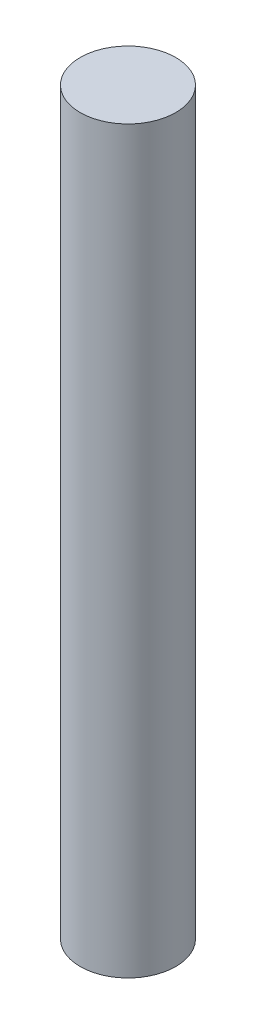
ISO-10303-21;
HEADER;
FILE_DESCRIPTION(('STEP AP214'),'2;1');
FILE_NAME('part.step','',(''),(''),'','','');
FILE_SCHEMA(('AUTOMOTIVE_DESIGN { 1 0 10303 214 1 1 1 1 }'));
ENDSEC;
DATA;
#1=APPLICATION_CONTEXT('core data for automotive mechanical design processes');
#2=APPLICATION_PROTOCOL_DEFINITION('international standard','automotive_design',2000,#1);
#3=PRODUCT_CONTEXT('',#1,'mechanical');
#4=PRODUCT('Part','Part','',(#3));
#5=PRODUCT_RELATED_PRODUCT_CATEGORY('part','',(#4));
#6=PRODUCT_DEFINITION_FORMATION('','',#4);
#7=PRODUCT_DEFINITION_CONTEXT('part definition',#1,'design');
#8=PRODUCT_DEFINITION('design','',#6,#7);
#9=PRODUCT_DEFINITION_SHAPE('','',#8);
#10=(LENGTH_UNIT() NAMED_UNIT(*) SI_UNIT(.MILLI.,.METRE.));
#11=(NAMED_UNIT(*) PLANE_ANGLE_UNIT() SI_UNIT($,.RADIAN.));
#12=(NAMED_UNIT(*) SI_UNIT($,.STERADIAN.) SOLID_ANGLE_UNIT());
#13=UNCERTAINTY_MEASURE_WITH_UNIT(LENGTH_MEASURE(1.E-05),#10,'distance_accuracy_value','');
#14=(GEOMETRIC_REPRESENTATION_CONTEXT(3) GLOBAL_UNCERTAINTY_ASSIGNED_CONTEXT((#13)) GLOBAL_UNIT_ASSIGNED_CONTEXT((#10,
#11,#12)) REPRESENTATION_CONTEXT('',''));
#15=CARTESIAN_POINT('',(0.,0.,0.));
#16=DIRECTION('',(0.,0.,1.));
#17=DIRECTION('',(1.,0.,0.));
#18=AXIS2_PLACEMENT_3D('',#15,#16,#17);
#19=CARTESIAN_POINT('',(0.,24.,0.));
#20=DIRECTION('',(0.,-1.,0.));
#21=DIRECTION('',(0.,0.,-1.));
#22=AXIS2_PLACEMENT_3D('',#19,#20,#21);
#23=CYLINDRICAL_SURFACE('',#22,1.55);
#24=CARTESIAN_POINT('',(0.,24.,0.));
#25=DIRECTION('',(0.,1.,0.));
#26=DIRECTION('',(0.,0.,1.));
#27=AXIS2_PLACEMENT_3D('',#24,#25,#26);
#28=CIRCLE('',#27,1.55);
#29=CARTESIAN_POINT('',(0.,24.,1.55));
#30=VERTEX_POINT('',#29);
#31=EDGE_CURVE('E10',#30,#30,#28,.T.);
#32=ORIENTED_EDGE('',*,*,#31,.F.);
#33=EDGE_LOOP('',(#32));
#34=FACE_BOUND('',#33,.T.);
#35=CARTESIAN_POINT('',(0.,0.,0.));
#36=DIRECTION('',(0.,1.,0.));
#37=DIRECTION('',(0.,0.,1.));
#38=AXIS2_PLACEMENT_3D('',#35,#36,#37);
#39=CIRCLE('',#38,1.55);
#40=CARTESIAN_POINT('',(0.,0.,1.55));
#41=VERTEX_POINT('',#40);
#42=EDGE_CURVE('E34',#41,#41,#39,.T.);
#43=ORIENTED_EDGE('',*,*,#42,.T.);
#44=EDGE_LOOP('',(#43));
#45=FACE_BOUND('',#44,.T.);
#46=ADVANCED_FACE('F31',(#34,#45),#23,.T.);
#47=CARTESIAN_POINT('',(0.,24.,0.));
#48=DIRECTION('',(0.,1.,0.));
#49=DIRECTION('',(0.,0.,1.));
#50=AXIS2_PLACEMENT_3D('',#47,#48,#49);
#51=PLANE('',#50);
#52=ORIENTED_EDGE('',*,*,#31,.T.);
#53=EDGE_LOOP('',(#52));
#54=FACE_BOUND('',#53,.T.);
#55=ADVANCED_FACE('F46',(#54),#51,.T.);
#56=CARTESIAN_POINT('',(0.,0.,0.));
#57=DIRECTION('',(0.,1.,0.));
#58=DIRECTION('',(0.,0.,1.));
#59=AXIS2_PLACEMENT_3D('',#56,#57,#58);
#60=PLANE('',#59);
#61=ORIENTED_EDGE('',*,*,#42,.F.);
#62=EDGE_LOOP('',(#61));
#63=FACE_BOUND('',#62,.T.);
#64=ADVANCED_FACE('F44',(#63),#60,.F.);
#65=CLOSED_SHELL('',(#46,#55,#64));
#66=MANIFOLD_SOLID_BREP('B2',#65);
#67=ADVANCED_BREP_SHAPE_REPRESENTATION('',(#18,#66),#14);
#68=SHAPE_DEFINITION_REPRESENTATION(#9,#67);
ENDSEC;
END-ISO-10303-21;
